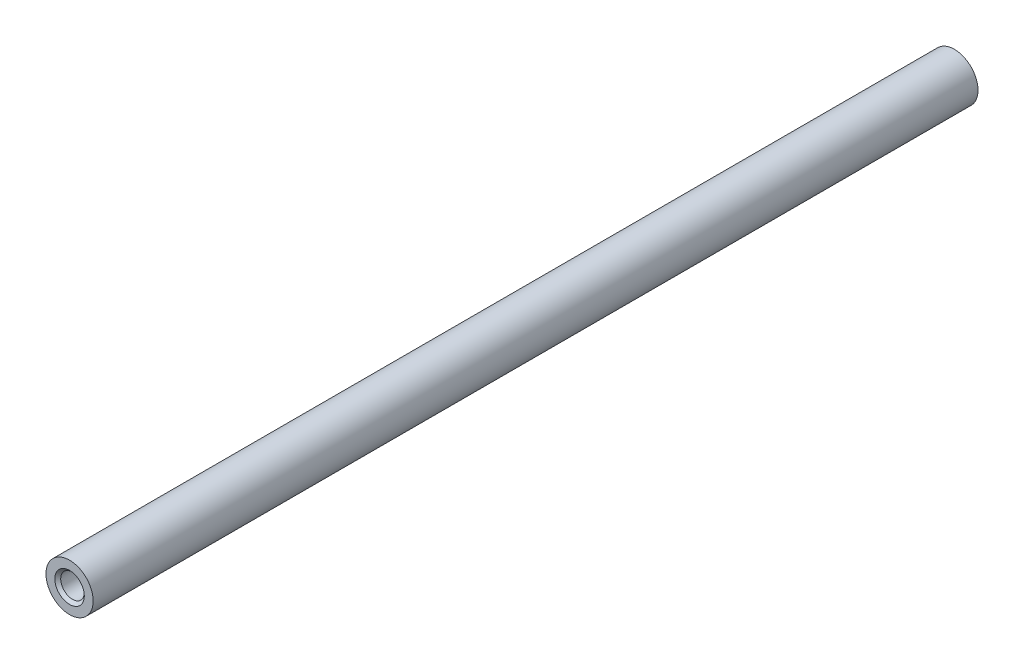
ISO-10303-21;
HEADER;
FILE_DESCRIPTION(('STEP AP214'),'2;1');
FILE_NAME('part.step','',(''),(''),'','','');
FILE_SCHEMA(('AUTOMOTIVE_DESIGN { 1 0 10303 214 1 1 1 1 }'));
ENDSEC;
DATA;
#1=APPLICATION_CONTEXT('core data for automotive mechanical design processes');
#2=APPLICATION_PROTOCOL_DEFINITION('international standard','automotive_design',2000,#1);
#3=PRODUCT_CONTEXT('',#1,'mechanical');
#4=PRODUCT('Part','Part','',(#3));
#5=PRODUCT_RELATED_PRODUCT_CATEGORY('part','',(#4));
#6=PRODUCT_DEFINITION_FORMATION('','',#4);
#7=PRODUCT_DEFINITION_CONTEXT('part definition',#1,'design');
#8=PRODUCT_DEFINITION('design','',#6,#7);
#9=PRODUCT_DEFINITION_SHAPE('','',#8);
#10=(LENGTH_UNIT() NAMED_UNIT(*) SI_UNIT(.MILLI.,.METRE.));
#11=(NAMED_UNIT(*) PLANE_ANGLE_UNIT() SI_UNIT($,.RADIAN.));
#12=(NAMED_UNIT(*) SI_UNIT($,.STERADIAN.) SOLID_ANGLE_UNIT());
#13=UNCERTAINTY_MEASURE_WITH_UNIT(LENGTH_MEASURE(1.E-05),#10,'distance_accuracy_value','');
#14=(GEOMETRIC_REPRESENTATION_CONTEXT(3) GLOBAL_UNCERTAINTY_ASSIGNED_CONTEXT((#13)) GLOBAL_UNIT_ASSIGNED_CONTEXT((#10,
#11,#12)) REPRESENTATION_CONTEXT('',''));
#15=CARTESIAN_POINT('',(0.,0.,0.));
#16=DIRECTION('',(0.,0.,1.));
#17=DIRECTION('',(1.,0.,0.));
#18=AXIS2_PLACEMENT_3D('',#15,#16,#17);
#19=CARTESIAN_POINT('',(0.,0.,150.));
#20=DIRECTION('',(0.,0.,-1.));
#21=DIRECTION('',(-1.,0.,0.));
#22=AXIS2_PLACEMENT_3D('',#19,#20,#21);
#23=CYLINDRICAL_SURFACE('',#22,4.);
#24=CARTESIAN_POINT('',(0.,0.,149.));
#25=DIRECTION('',(0.,0.,1.));
#26=DIRECTION('',(1.,0.,0.));
#27=AXIS2_PLACEMENT_3D('',#24,#25,#26);
#28=CIRCLE('',#27,4.);
#29=CARTESIAN_POINT('',(4.,0.,149.));
#30=VERTEX_POINT('',#29);
#31=EDGE_CURVE('E43',#30,#30,#28,.T.);
#32=ORIENTED_EDGE('',*,*,#31,.T.);
#33=EDGE_LOOP('',(#32));
#34=FACE_BOUND('',#33,.T.);
#35=CARTESIAN_POINT('',(0.,0.,-120.));
#36=DIRECTION('',(0.,0.,-1.));
#37=DIRECTION('',(-1.,0.,0.));
#38=AXIS2_PLACEMENT_3D('',#35,#36,#37);
#39=CIRCLE('',#38,4.);
#40=CARTESIAN_POINT('',(-4.,0.,-120.));
#41=VERTEX_POINT('',#40);
#42=EDGE_CURVE('E54',#41,#41,#39,.T.);
#43=ORIENTED_EDGE('',*,*,#42,.T.);
#44=EDGE_LOOP('',(#43));
#45=FACE_BOUND('',#44,.T.);
#46=ADVANCED_FACE('F35',(#34,#45),#23,.F.);
#47=CARTESIAN_POINT('',(0.,0.,150.));
#48=DIRECTION('',(0.,0.,1.));
#49=DIRECTION('',(1.,0.,0.));
#50=AXIS2_PLACEMENT_3D('',#47,#48,#49);
#51=PLANE('',#50);
#52=CARTESIAN_POINT('',(0.,0.,150.));
#53=DIRECTION('',(0.,0.,1.));
#54=DIRECTION('',(1.,0.,0.));
#55=AXIS2_PLACEMENT_3D('',#52,#53,#54);
#56=CIRCLE('',#55,5.);
#57=CARTESIAN_POINT('',(5.,0.,150.));
#58=VERTEX_POINT('',#57);
#59=EDGE_CURVE('E10',#58,#58,#56,.F.);
#60=ORIENTED_EDGE('',*,*,#59,.T.);
#61=EDGE_LOOP('',(#60));
#62=FACE_BOUND('',#61,.T.);
#63=CARTESIAN_POINT('',(0.,0.,150.));
#64=DIRECTION('',(0.,0.,1.));
#65=DIRECTION('',(1.,0.,0.));
#66=AXIS2_PLACEMENT_3D('',#63,#64,#65);
#67=CIRCLE('',#66,8.);
#68=CARTESIAN_POINT('',(8.,0.,150.));
#69=VERTEX_POINT('',#68);
#70=EDGE_CURVE('E47',#69,#69,#67,.T.);
#71=ORIENTED_EDGE('',*,*,#70,.T.);
#72=EDGE_LOOP('',(#71));
#73=FACE_BOUND('',#72,.T.);
#74=ADVANCED_FACE('F78',(#62,#73),#51,.T.);
#75=CARTESIAN_POINT('',(0.,0.,-150.));
#76=DIRECTION('',(0.,0.,1.));
#77=DIRECTION('',(1.,0.,0.));
#78=AXIS2_PLACEMENT_3D('',#75,#76,#77);
#79=PLANE('',#78);
#80=CARTESIAN_POINT('',(0.,0.,-150.));
#81=DIRECTION('',(0.,0.,-1.));
#82=DIRECTION('',(-1.,0.,0.));
#83=AXIS2_PLACEMENT_3D('',#80,#81,#82);
#84=CIRCLE('',#83,5.);
#85=CARTESIAN_POINT('',(-5.,0.,-150.));
#86=VERTEX_POINT('',#85);
#87=EDGE_CURVE('E60',#86,#86,#84,.T.);
#88=ORIENTED_EDGE('',*,*,#87,.F.);
#89=EDGE_LOOP('',(#88));
#90=FACE_BOUND('',#89,.T.);
#91=CARTESIAN_POINT('',(0.,0.,-150.));
#92=DIRECTION('',(0.,0.,1.));
#93=DIRECTION('',(1.,0.,0.));
#94=AXIS2_PLACEMENT_3D('',#91,#92,#93);
#95=CIRCLE('',#94,8.);
#96=CARTESIAN_POINT('',(8.,0.,-150.));
#97=VERTEX_POINT('',#96);
#98=EDGE_CURVE('E51',#97,#97,#95,.T.);
#99=ORIENTED_EDGE('',*,*,#98,.F.);
#100=EDGE_LOOP('',(#99));
#101=FACE_BOUND('',#100,.T.);
#102=ADVANCED_FACE('F75',(#90,#101),#79,.F.);
#103=CARTESIAN_POINT('',(0.,0.,150.));
#104=DIRECTION('',(0.,0.,-1.));
#105=DIRECTION('',(-1.,0.,0.));
#106=AXIS2_PLACEMENT_3D('',#103,#104,#105);
#107=CYLINDRICAL_SURFACE('',#106,8.);
#108=ORIENTED_EDGE('',*,*,#70,.F.);
#109=EDGE_LOOP('',(#108));
#110=FACE_BOUND('',#109,.T.);
#111=ORIENTED_EDGE('',*,*,#98,.T.);
#112=EDGE_LOOP('',(#111));
#113=FACE_BOUND('',#112,.T.);
#114=ADVANCED_FACE('F71',(#110,#113),#107,.T.);
#115=CARTESIAN_POINT('',(0.,0.,-120.));
#116=DIRECTION('',(0.,0.,-1.));
#117=DIRECTION('',(-1.,0.,0.));
#118=AXIS2_PLACEMENT_3D('',#115,#116,#117);
#119=CYLINDRICAL_SURFACE('',#118,5.);
#120=CARTESIAN_POINT('',(0.,0.,-120.));
#121=DIRECTION('',(0.,0.,-1.));
#122=DIRECTION('',(-1.,0.,0.));
#123=AXIS2_PLACEMENT_3D('',#120,#121,#122);
#124=CIRCLE('',#123,5.);
#125=CARTESIAN_POINT('',(-5.,0.,-120.));
#126=VERTEX_POINT('',#125);
#127=EDGE_CURVE('E57',#126,#126,#124,.T.);
#128=ORIENTED_EDGE('',*,*,#127,.F.);
#129=EDGE_LOOP('',(#128));
#130=FACE_BOUND('',#129,.T.);
#131=ORIENTED_EDGE('',*,*,#87,.T.);
#132=EDGE_LOOP('',(#131));
#133=FACE_BOUND('',#132,.T.);
#134=ADVANCED_FACE('F68',(#130,#133),#119,.F.);
#135=CARTESIAN_POINT('',(0.,0.,-120.));
#136=DIRECTION('',(0.,0.,-1.));
#137=DIRECTION('',(-1.,0.,0.));
#138=AXIS2_PLACEMENT_3D('',#135,#136,#137);
#139=PLANE('',#138);
#140=ORIENTED_EDGE('',*,*,#42,.F.);
#141=EDGE_LOOP('',(#140));
#142=FACE_BOUND('',#141,.T.);
#143=ORIENTED_EDGE('',*,*,#127,.T.);
#144=EDGE_LOOP('',(#143));
#145=FACE_BOUND('',#144,.T.);
#146=ADVANCED_FACE('F66',(#142,#145),#139,.T.);
#147=CARTESIAN_POINT('',(0.,0.,149.));
#148=DIRECTION('',(0.,0.,1.));
#149=DIRECTION('',(1.,0.,0.));
#150=AXIS2_PLACEMENT_3D('',#147,#148,#149);
#151=CONICAL_SURFACE('',#150,4.,0.785398163397436);
#152=ORIENTED_EDGE('',*,*,#59,.F.);
#153=EDGE_LOOP('',(#152));
#154=FACE_BOUND('',#153,.T.);
#155=ORIENTED_EDGE('',*,*,#31,.F.);
#156=EDGE_LOOP('',(#155));
#157=FACE_BOUND('',#156,.T.);
#158=ADVANCED_FACE('F38',(#154,#157),#151,.F.);
#159=CLOSED_SHELL('',(#46,#74,#102,#114,#134,#146,#158));
#160=MANIFOLD_SOLID_BREP('B2',#159);
#161=ADVANCED_BREP_SHAPE_REPRESENTATION('',(#18,#160),#14);
#162=SHAPE_DEFINITION_REPRESENTATION(#9,#161);
ENDSEC;
END-ISO-10303-21;
